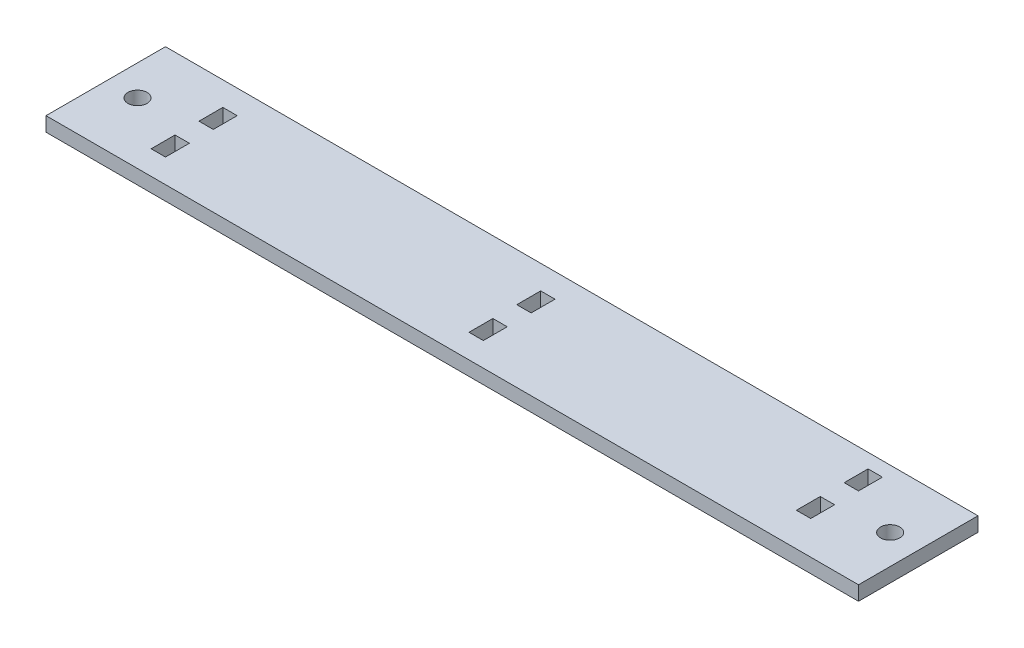
ISO-10303-21;
HEADER;
FILE_DESCRIPTION(('STEP AP214'),'2;1');
FILE_NAME('part.step','',(''),(''),'','','');
FILE_SCHEMA(('AUTOMOTIVE_DESIGN { 1 0 10303 214 1 1 1 1 }'));
ENDSEC;
DATA;
#1=APPLICATION_CONTEXT('core data for automotive mechanical design processes');
#2=APPLICATION_PROTOCOL_DEFINITION('international standard','automotive_design',2000,#1);
#3=PRODUCT_CONTEXT('',#1,'mechanical');
#4=PRODUCT('Part','Part','',(#3));
#5=PRODUCT_RELATED_PRODUCT_CATEGORY('part','',(#4));
#6=PRODUCT_DEFINITION_FORMATION('','',#4);
#7=PRODUCT_DEFINITION_CONTEXT('part definition',#1,'design');
#8=PRODUCT_DEFINITION('design','',#6,#7);
#9=PRODUCT_DEFINITION_SHAPE('','',#8);
#10=(LENGTH_UNIT() NAMED_UNIT(*) SI_UNIT(.MILLI.,.METRE.));
#11=(NAMED_UNIT(*) PLANE_ANGLE_UNIT() SI_UNIT($,.RADIAN.));
#12=(NAMED_UNIT(*) SI_UNIT($,.STERADIAN.) SOLID_ANGLE_UNIT());
#13=UNCERTAINTY_MEASURE_WITH_UNIT(LENGTH_MEASURE(1.E-05),#10,'distance_accuracy_value','');
#14=(GEOMETRIC_REPRESENTATION_CONTEXT(3) GLOBAL_UNCERTAINTY_ASSIGNED_CONTEXT((#13)) GLOBAL_UNIT_ASSIGNED_CONTEXT((#10,
#11,#12)) REPRESENTATION_CONTEXT('',''));
#15=CARTESIAN_POINT('',(0.,0.,0.));
#16=DIRECTION('',(0.,0.,1.));
#17=DIRECTION('',(1.,0.,0.));
#18=AXIS2_PLACEMENT_3D('',#15,#16,#17);
#19=CARTESIAN_POINT('',(-85.,3.,12.5));
#20=DIRECTION('',(0.,1.,0.));
#21=DIRECTION('',(0.,0.,1.));
#22=AXIS2_PLACEMENT_3D('',#19,#20,#21);
#23=PLANE('',#22);
#24=CARTESIAN_POINT('',(-78.65,3.,-0.29));
#25=DIRECTION('',(0.,1.,0.));
#26=DIRECTION('',(0.,0.,1.));
#27=AXIS2_PLACEMENT_3D('',#24,#25,#26);
#28=CIRCLE('',#27,2.);
#29=CARTESIAN_POINT('',(-78.65,3.,1.71));
#30=VERTEX_POINT('',#29);
#31=EDGE_CURVE('E246',#30,#30,#28,.T.);
#32=ORIENTED_EDGE('',*,*,#31,.F.);
#33=EDGE_LOOP('',(#32));
#34=FACE_BOUND('',#33,.T.);
#35=DIRECTION('',(1.,0.,0.));
#36=VECTOR('',#35,1.);
#37=CARTESIAN_POINT('',(65.,3.,-4.5));
#38=LINE('',#37,#36);
#39=CARTESIAN_POINT('',(65.,3.,-4.5));
#40=VERTEX_POINT('',#39);
#41=CARTESIAN_POINT('',(68.,3.,-4.5));
#42=VERTEX_POINT('',#41);
#43=EDGE_CURVE('E258',#40,#42,#38,.T.);
#44=ORIENTED_EDGE('',*,*,#43,.F.);
#45=DIRECTION('',(0.,0.,1.));
#46=VECTOR('',#45,1.);
#47=CARTESIAN_POINT('',(65.,3.,-9.5));
#48=LINE('',#47,#46);
#49=CARTESIAN_POINT('',(65.,3.,-9.5));
#50=VERTEX_POINT('',#49);
#51=EDGE_CURVE('E256',#50,#40,#48,.T.);
#52=ORIENTED_EDGE('',*,*,#51,.F.);
#53=DIRECTION('',(-1.,0.,0.));
#54=VECTOR('',#53,1.);
#55=CARTESIAN_POINT('',(65.,3.,-9.5));
#56=LINE('',#55,#54);
#57=CARTESIAN_POINT('',(68.,3.,-9.5));
#58=VERTEX_POINT('',#57);
#59=EDGE_CURVE('E264',#58,#50,#56,.T.);
#60=ORIENTED_EDGE('',*,*,#59,.F.);
#61=DIRECTION('',(0.,0.,-1.));
#62=VECTOR('',#61,1.);
#63=CARTESIAN_POINT('',(68.,3.,-9.5));
#64=LINE('',#63,#62);
#65=EDGE_CURVE('E261',#42,#58,#64,.T.);
#66=ORIENTED_EDGE('',*,*,#65,.F.);
#67=EDGE_LOOP('',(#44,#52,#60,#66));
#68=FACE_BOUND('',#67,.T.);
#69=DIRECTION('',(1.,0.,0.));
#70=VECTOR('',#69,1.);
#71=CARTESIAN_POINT('',(-68.,3.,-2.5));
#72=LINE('',#71,#70);
#73=CARTESIAN_POINT('',(-68.,3.,-2.5));
#74=VERTEX_POINT('',#73);
#75=CARTESIAN_POINT('',(-65.,3.,-2.5));
#76=VERTEX_POINT('',#75);
#77=EDGE_CURVE('E320',#74,#76,#72,.T.);
#78=ORIENTED_EDGE('',*,*,#77,.F.);
#79=DIRECTION('',(0.,0.,1.));
#80=VECTOR('',#79,1.);
#81=CARTESIAN_POINT('',(-68.,3.,-7.5));
#82=LINE('',#81,#80);
#83=CARTESIAN_POINT('',(-68.,3.,-7.5));
#84=VERTEX_POINT('',#83);
#85=EDGE_CURVE('E318',#84,#74,#82,.T.);
#86=ORIENTED_EDGE('',*,*,#85,.F.);
#87=DIRECTION('',(-1.,0.,0.));
#88=VECTOR('',#87,1.);
#89=CARTESIAN_POINT('',(-68.,3.,-7.5));
#90=LINE('',#89,#88);
#91=CARTESIAN_POINT('',(-65.,3.,-7.5));
#92=VERTEX_POINT('',#91);
#93=EDGE_CURVE('E326',#92,#84,#90,.T.);
#94=ORIENTED_EDGE('',*,*,#93,.F.);
#95=DIRECTION('',(0.,0.,-1.));
#96=VECTOR('',#95,1.);
#97=CARTESIAN_POINT('',(-65.,3.,-7.5));
#98=LINE('',#97,#96);
#99=EDGE_CURVE('E323',#76,#92,#98,.T.);
#100=ORIENTED_EDGE('',*,*,#99,.F.);
#101=EDGE_LOOP('',(#78,#86,#94,#100));
#102=FACE_BOUND('',#101,.T.);
#103=DIRECTION('',(1.,0.,0.));
#104=VECTOR('',#103,1.);
#105=CARTESIAN_POINT('',(-1.5,3.,-2.5));
#106=LINE('',#105,#104);
#107=CARTESIAN_POINT('',(-1.5,3.,-2.5));
#108=VERTEX_POINT('',#107);
#109=CARTESIAN_POINT('',(1.5,3.,-2.5));
#110=VERTEX_POINT('',#109);
#111=EDGE_CURVE('E382',#108,#110,#106,.T.);
#112=ORIENTED_EDGE('',*,*,#111,.F.);
#113=DIRECTION('',(0.,0.,1.));
#114=VECTOR('',#113,1.);
#115=CARTESIAN_POINT('',(-1.5,3.,-7.5));
#116=LINE('',#115,#114);
#117=CARTESIAN_POINT('',(-1.5,3.,-7.5));
#118=VERTEX_POINT('',#117);
#119=EDGE_CURVE('E380',#118,#108,#116,.T.);
#120=ORIENTED_EDGE('',*,*,#119,.F.);
#121=DIRECTION('',(-1.,0.,0.));
#122=VECTOR('',#121,1.);
#123=CARTESIAN_POINT('',(-1.5,3.,-7.5));
#124=LINE('',#123,#122);
#125=CARTESIAN_POINT('',(1.5,3.,-7.5));
#126=VERTEX_POINT('',#125);
#127=EDGE_CURVE('E388',#126,#118,#124,.T.);
#128=ORIENTED_EDGE('',*,*,#127,.F.);
#129=DIRECTION('',(0.,0.,-1.));
#130=VECTOR('',#129,1.);
#131=CARTESIAN_POINT('',(1.5,3.,-7.5));
#132=LINE('',#131,#130);
#133=EDGE_CURVE('E385',#110,#126,#132,.T.);
#134=ORIENTED_EDGE('',*,*,#133,.F.);
#135=EDGE_LOOP('',(#112,#120,#128,#134));
#136=FACE_BOUND('',#135,.T.);
#137=DIRECTION('',(0.,0.,1.));
#138=VECTOR('',#137,1.);
#139=CARTESIAN_POINT('',(-85.,3.,-12.5));
#140=LINE('',#139,#138);
#141=CARTESIAN_POINT('',(-85.,3.,-12.5));
#142=VERTEX_POINT('',#141);
#143=CARTESIAN_POINT('',(-85.,3.,12.5));
#144=VERTEX_POINT('',#143);
#145=EDGE_CURVE('E411',#142,#144,#140,.T.);
#146=ORIENTED_EDGE('',*,*,#145,.T.);
#147=DIRECTION('',(1.,0.,0.));
#148=VECTOR('',#147,1.);
#149=CARTESIAN_POINT('',(-85.,3.,12.5));
#150=LINE('',#149,#148);
#151=CARTESIAN_POINT('',(85.,3.,12.5));
#152=VERTEX_POINT('',#151);
#153=EDGE_CURVE('E414',#144,#152,#150,.T.);
#154=ORIENTED_EDGE('',*,*,#153,.T.);
#155=DIRECTION('',(0.,0.,-1.));
#156=VECTOR('',#155,1.);
#157=CARTESIAN_POINT('',(85.,3.,-12.5));
#158=LINE('',#157,#156);
#159=CARTESIAN_POINT('',(85.,3.,-12.5));
#160=VERTEX_POINT('',#159);
#161=EDGE_CURVE('E417',#152,#160,#158,.T.);
#162=ORIENTED_EDGE('',*,*,#161,.T.);
#163=DIRECTION('',(-1.,0.,0.));
#164=VECTOR('',#163,1.);
#165=CARTESIAN_POINT('',(-85.,3.,-12.5));
#166=LINE('',#165,#164);
#167=EDGE_CURVE('E419',#160,#142,#166,.T.);
#168=ORIENTED_EDGE('',*,*,#167,.T.);
#169=EDGE_LOOP('',(#146,#154,#162,#168));
#170=FACE_BOUND('',#169,.T.);
#171=DIRECTION('',(1.,0.,0.));
#172=VECTOR('',#171,1.);
#173=CARTESIAN_POINT('',(-1.5,3.,7.5));
#174=LINE('',#173,#172);
#175=CARTESIAN_POINT('',(-1.5,3.,7.5));
#176=VERTEX_POINT('',#175);
#177=CARTESIAN_POINT('',(1.5,3.,7.5));
#178=VERTEX_POINT('',#177);
#179=EDGE_CURVE('E351',#176,#178,#174,.T.);
#180=ORIENTED_EDGE('',*,*,#179,.F.);
#181=DIRECTION('',(0.,0.,1.));
#182=VECTOR('',#181,1.);
#183=CARTESIAN_POINT('',(-1.5,3.,2.5));
#184=LINE('',#183,#182);
#185=CARTESIAN_POINT('',(-1.5,3.,2.5));
#186=VERTEX_POINT('',#185);
#187=EDGE_CURVE('E349',#186,#176,#184,.T.);
#188=ORIENTED_EDGE('',*,*,#187,.F.);
#189=DIRECTION('',(-1.,0.,0.));
#190=VECTOR('',#189,1.);
#191=CARTESIAN_POINT('',(-1.5,3.,2.5));
#192=LINE('',#191,#190);
#193=CARTESIAN_POINT('',(1.5,3.,2.5));
#194=VERTEX_POINT('',#193);
#195=EDGE_CURVE('E357',#194,#186,#192,.T.);
#196=ORIENTED_EDGE('',*,*,#195,.F.);
#197=DIRECTION('',(0.,0.,-1.));
#198=VECTOR('',#197,1.);
#199=CARTESIAN_POINT('',(1.5,3.,2.5));
#200=LINE('',#199,#198);
#201=EDGE_CURVE('E354',#178,#194,#200,.T.);
#202=ORIENTED_EDGE('',*,*,#201,.F.);
#203=EDGE_LOOP('',(#180,#188,#196,#202));
#204=FACE_BOUND('',#203,.T.);
#205=DIRECTION('',(1.,0.,0.));
#206=VECTOR('',#205,1.);
#207=CARTESIAN_POINT('',(-68.,3.,7.5));
#208=LINE('',#207,#206);
#209=CARTESIAN_POINT('',(-68.,3.,7.5));
#210=VERTEX_POINT('',#209);
#211=CARTESIAN_POINT('',(-65.,3.,7.5));
#212=VERTEX_POINT('',#211);
#213=EDGE_CURVE('E289',#210,#212,#208,.T.);
#214=ORIENTED_EDGE('',*,*,#213,.F.);
#215=DIRECTION('',(0.,0.,1.));
#216=VECTOR('',#215,1.);
#217=CARTESIAN_POINT('',(-68.,3.,2.5));
#218=LINE('',#217,#216);
#219=CARTESIAN_POINT('',(-68.,3.,2.5));
#220=VERTEX_POINT('',#219);
#221=EDGE_CURVE('E287',#220,#210,#218,.T.);
#222=ORIENTED_EDGE('',*,*,#221,.F.);
#223=DIRECTION('',(-1.,0.,0.));
#224=VECTOR('',#223,1.);
#225=CARTESIAN_POINT('',(-68.,3.,2.5));
#226=LINE('',#225,#224);
#227=CARTESIAN_POINT('',(-65.,3.,2.5));
#228=VERTEX_POINT('',#227);
#229=EDGE_CURVE('E295',#228,#220,#226,.T.);
#230=ORIENTED_EDGE('',*,*,#229,.F.);
#231=DIRECTION('',(0.,0.,-1.));
#232=VECTOR('',#231,1.);
#233=CARTESIAN_POINT('',(-65.,3.,2.5));
#234=LINE('',#233,#232);
#235=EDGE_CURVE('E292',#212,#228,#234,.T.);
#236=ORIENTED_EDGE('',*,*,#235,.F.);
#237=EDGE_LOOP('',(#214,#222,#230,#236));
#238=FACE_BOUND('',#237,.T.);
#239=DIRECTION('',(1.,0.,0.));
#240=VECTOR('',#239,1.);
#241=CARTESIAN_POINT('',(65.,3.,5.5));
#242=LINE('',#241,#240);
#243=CARTESIAN_POINT('',(65.,3.,5.5));
#244=VERTEX_POINT('',#243);
#245=CARTESIAN_POINT('',(68.,3.,5.5));
#246=VERTEX_POINT('',#245);
#247=EDGE_CURVE('E225',#244,#246,#242,.T.);
#248=ORIENTED_EDGE('',*,*,#247,.F.);
#249=DIRECTION('',(0.,0.,1.));
#250=VECTOR('',#249,1.);
#251=CARTESIAN_POINT('',(65.,3.,0.500000000000002));
#252=LINE('',#251,#250);
#253=CARTESIAN_POINT('',(65.,3.,0.500000000000002));
#254=VERTEX_POINT('',#253);
#255=EDGE_CURVE('E217',#254,#244,#252,.T.);
#256=ORIENTED_EDGE('',*,*,#255,.F.);
#257=DIRECTION('',(-1.,0.,0.));
#258=VECTOR('',#257,1.);
#259=CARTESIAN_POINT('',(65.,3.,0.500000000000002));
#260=LINE('',#259,#258);
#261=CARTESIAN_POINT('',(68.,3.,0.500000000000002));
#262=VERTEX_POINT('',#261);
#263=EDGE_CURVE('E240',#262,#254,#260,.T.);
#264=ORIENTED_EDGE('',*,*,#263,.F.);
#265=DIRECTION('',(0.,0.,-1.));
#266=VECTOR('',#265,1.);
#267=CARTESIAN_POINT('',(68.,3.,0.500000000000002));
#268=LINE('',#267,#266);
#269=EDGE_CURVE('E238',#246,#262,#268,.T.);
#270=ORIENTED_EDGE('',*,*,#269,.F.);
#271=EDGE_LOOP('',(#248,#256,#264,#270));
#272=FACE_BOUND('',#271,.T.);
#273=CARTESIAN_POINT('',(78.83,3.,-0.29));
#274=DIRECTION('',(0.,1.,0.));
#275=DIRECTION('',(0.,0.,1.));
#276=AXIS2_PLACEMENT_3D('',#273,#274,#275);
#277=CIRCLE('',#276,2.);
#278=CARTESIAN_POINT('',(78.83,3.,1.71));
#279=VERTEX_POINT('',#278);
#280=EDGE_CURVE('E595',#279,#279,#277,.T.);
#281=ORIENTED_EDGE('',*,*,#280,.F.);
#282=EDGE_LOOP('',(#281));
#283=FACE_BOUND('',#282,.T.);
#284=ADVANCED_FACE('F32',(#34,#68,#102,#136,#170,#204,#238,#272,#283),#23,.T.);
#285=CARTESIAN_POINT('',(-85.,0.,12.5));
#286=DIRECTION('',(0.,1.,0.));
#287=DIRECTION('',(0.,0.,1.));
#288=AXIS2_PLACEMENT_3D('',#285,#286,#287);
#289=PLANE('',#288);
#290=CARTESIAN_POINT('',(-78.65,0.,-0.29));
#291=DIRECTION('',(0.,1.,0.));
#292=DIRECTION('',(0.,0.,1.));
#293=AXIS2_PLACEMENT_3D('',#290,#291,#292);
#294=CIRCLE('',#293,2.);
#295=CARTESIAN_POINT('',(-78.65,0.,1.71));
#296=VERTEX_POINT('',#295);
#297=EDGE_CURVE('E601',#296,#296,#294,.T.);
#298=ORIENTED_EDGE('',*,*,#297,.T.);
#299=EDGE_LOOP('',(#298));
#300=FACE_BOUND('',#299,.T.);
#301=DIRECTION('',(0.,0.,1.));
#302=VECTOR('',#301,1.);
#303=CARTESIAN_POINT('',(65.,0.,-9.5));
#304=LINE('',#303,#302);
#305=CARTESIAN_POINT('',(65.,0.,-9.5));
#306=VERTEX_POINT('',#305);
#307=CARTESIAN_POINT('',(65.,0.,-4.5));
#308=VERTEX_POINT('',#307);
#309=EDGE_CURVE('E233',#306,#308,#304,.T.);
#310=ORIENTED_EDGE('',*,*,#309,.T.);
#311=DIRECTION('',(1.,0.,0.));
#312=VECTOR('',#311,1.);
#313=CARTESIAN_POINT('',(65.,0.,-4.5));
#314=LINE('',#313,#312);
#315=CARTESIAN_POINT('',(68.,0.,-4.5));
#316=VERTEX_POINT('',#315);
#317=EDGE_CURVE('E269',#308,#316,#314,.T.);
#318=ORIENTED_EDGE('',*,*,#317,.T.);
#319=DIRECTION('',(0.,0.,-1.));
#320=VECTOR('',#319,1.);
#321=CARTESIAN_POINT('',(68.,0.,-9.5));
#322=LINE('',#321,#320);
#323=CARTESIAN_POINT('',(68.,0.,-9.5));
#324=VERTEX_POINT('',#323);
#325=EDGE_CURVE('E272',#316,#324,#322,.T.);
#326=ORIENTED_EDGE('',*,*,#325,.T.);
#327=DIRECTION('',(-1.,0.,0.));
#328=VECTOR('',#327,1.);
#329=CARTESIAN_POINT('',(65.,0.,-9.5));
#330=LINE('',#329,#328);
#331=EDGE_CURVE('E259',#324,#306,#330,.T.);
#332=ORIENTED_EDGE('',*,*,#331,.T.);
#333=EDGE_LOOP('',(#310,#318,#326,#332));
#334=FACE_BOUND('',#333,.T.);
#335=DIRECTION('',(0.,0.,1.));
#336=VECTOR('',#335,1.);
#337=CARTESIAN_POINT('',(-68.,0.,-7.5));
#338=LINE('',#337,#336);
#339=CARTESIAN_POINT('',(-68.,0.,-7.5));
#340=VERTEX_POINT('',#339);
#341=CARTESIAN_POINT('',(-68.,0.,-2.5));
#342=VERTEX_POINT('',#341);
#343=EDGE_CURVE('E317',#340,#342,#338,.T.);
#344=ORIENTED_EDGE('',*,*,#343,.T.);
#345=DIRECTION('',(1.,0.,0.));
#346=VECTOR('',#345,1.);
#347=CARTESIAN_POINT('',(-68.,0.,-2.5));
#348=LINE('',#347,#346);
#349=CARTESIAN_POINT('',(-65.,0.,-2.5));
#350=VERTEX_POINT('',#349);
#351=EDGE_CURVE('E331',#342,#350,#348,.T.);
#352=ORIENTED_EDGE('',*,*,#351,.T.);
#353=DIRECTION('',(0.,0.,-1.));
#354=VECTOR('',#353,1.);
#355=CARTESIAN_POINT('',(-65.,0.,-7.5));
#356=LINE('',#355,#354);
#357=CARTESIAN_POINT('',(-65.,0.,-7.5));
#358=VERTEX_POINT('',#357);
#359=EDGE_CURVE('E334',#350,#358,#356,.T.);
#360=ORIENTED_EDGE('',*,*,#359,.T.);
#361=DIRECTION('',(-1.,0.,0.));
#362=VECTOR('',#361,1.);
#363=CARTESIAN_POINT('',(-68.,0.,-7.5));
#364=LINE('',#363,#362);
#365=EDGE_CURVE('E321',#358,#340,#364,.T.);
#366=ORIENTED_EDGE('',*,*,#365,.T.);
#367=EDGE_LOOP('',(#344,#352,#360,#366));
#368=FACE_BOUND('',#367,.T.);
#369=DIRECTION('',(0.,0.,1.));
#370=VECTOR('',#369,1.);
#371=CARTESIAN_POINT('',(-1.5,0.,-7.5));
#372=LINE('',#371,#370);
#373=CARTESIAN_POINT('',(-1.5,0.,-7.5));
#374=VERTEX_POINT('',#373);
#375=CARTESIAN_POINT('',(-1.5,0.,-2.5));
#376=VERTEX_POINT('',#375);
#377=EDGE_CURVE('E379',#374,#376,#372,.T.);
#378=ORIENTED_EDGE('',*,*,#377,.T.);
#379=DIRECTION('',(1.,0.,0.));
#380=VECTOR('',#379,1.);
#381=CARTESIAN_POINT('',(-1.5,0.,-2.5));
#382=LINE('',#381,#380);
#383=CARTESIAN_POINT('',(1.5,0.,-2.5));
#384=VERTEX_POINT('',#383);
#385=EDGE_CURVE('E393',#376,#384,#382,.T.);
#386=ORIENTED_EDGE('',*,*,#385,.T.);
#387=DIRECTION('',(0.,0.,-1.));
#388=VECTOR('',#387,1.);
#389=CARTESIAN_POINT('',(1.5,0.,-7.5));
#390=LINE('',#389,#388);
#391=CARTESIAN_POINT('',(1.5,0.,-7.5));
#392=VERTEX_POINT('',#391);
#393=EDGE_CURVE('E396',#384,#392,#390,.T.);
#394=ORIENTED_EDGE('',*,*,#393,.T.);
#395=DIRECTION('',(-1.,0.,0.));
#396=VECTOR('',#395,1.);
#397=CARTESIAN_POINT('',(-1.5,0.,-7.5));
#398=LINE('',#397,#396);
#399=EDGE_CURVE('E383',#392,#374,#398,.T.);
#400=ORIENTED_EDGE('',*,*,#399,.T.);
#401=EDGE_LOOP('',(#378,#386,#394,#400));
#402=FACE_BOUND('',#401,.T.);
#403=DIRECTION('',(0.,0.,1.));
#404=VECTOR('',#403,1.);
#405=CARTESIAN_POINT('',(-85.,0.,-12.5));
#406=LINE('',#405,#404);
#407=CARTESIAN_POINT('',(-85.,0.,-12.5));
#408=VERTEX_POINT('',#407);
#409=CARTESIAN_POINT('',(-85.,0.,12.5));
#410=VERTEX_POINT('',#409);
#411=EDGE_CURVE('E410',#408,#410,#406,.T.);
#412=ORIENTED_EDGE('',*,*,#411,.F.);
#413=DIRECTION('',(-1.,0.,0.));
#414=VECTOR('',#413,1.);
#415=CARTESIAN_POINT('',(-85.,0.,-12.5));
#416=LINE('',#415,#414);
#417=CARTESIAN_POINT('',(85.,0.,-12.5));
#418=VERTEX_POINT('',#417);
#419=EDGE_CURVE('E415',#418,#408,#416,.T.);
#420=ORIENTED_EDGE('',*,*,#419,.F.);
#421=DIRECTION('',(0.,0.,-1.));
#422=VECTOR('',#421,1.);
#423=CARTESIAN_POINT('',(85.,0.,-12.5));
#424=LINE('',#423,#422);
#425=CARTESIAN_POINT('',(85.,0.,12.5));
#426=VERTEX_POINT('',#425);
#427=EDGE_CURVE('E426',#426,#418,#424,.T.);
#428=ORIENTED_EDGE('',*,*,#427,.F.);
#429=DIRECTION('',(1.,0.,0.));
#430=VECTOR('',#429,1.);
#431=CARTESIAN_POINT('',(-85.,0.,12.5));
#432=LINE('',#431,#430);
#433=EDGE_CURVE('E424',#410,#426,#432,.T.);
#434=ORIENTED_EDGE('',*,*,#433,.F.);
#435=EDGE_LOOP('',(#412,#420,#428,#434));
#436=FACE_BOUND('',#435,.T.);
#437=DIRECTION('',(0.,0.,1.));
#438=VECTOR('',#437,1.);
#439=CARTESIAN_POINT('',(-1.5,0.,2.5));
#440=LINE('',#439,#438);
#441=CARTESIAN_POINT('',(-1.5,0.,2.5));
#442=VERTEX_POINT('',#441);
#443=CARTESIAN_POINT('',(-1.5,0.,7.5));
#444=VERTEX_POINT('',#443);
#445=EDGE_CURVE('E348',#442,#444,#440,.T.);
#446=ORIENTED_EDGE('',*,*,#445,.T.);
#447=DIRECTION('',(1.,0.,0.));
#448=VECTOR('',#447,1.);
#449=CARTESIAN_POINT('',(-1.5,0.,7.5));
#450=LINE('',#449,#448);
#451=CARTESIAN_POINT('',(1.5,0.,7.5));
#452=VERTEX_POINT('',#451);
#453=EDGE_CURVE('E362',#444,#452,#450,.T.);
#454=ORIENTED_EDGE('',*,*,#453,.T.);
#455=DIRECTION('',(0.,0.,-1.));
#456=VECTOR('',#455,1.);
#457=CARTESIAN_POINT('',(1.5,0.,2.5));
#458=LINE('',#457,#456);
#459=CARTESIAN_POINT('',(1.5,0.,2.5));
#460=VERTEX_POINT('',#459);
#461=EDGE_CURVE('E365',#452,#460,#458,.T.);
#462=ORIENTED_EDGE('',*,*,#461,.T.);
#463=DIRECTION('',(-1.,0.,0.));
#464=VECTOR('',#463,1.);
#465=CARTESIAN_POINT('',(-1.5,0.,2.5));
#466=LINE('',#465,#464);
#467=EDGE_CURVE('E352',#460,#442,#466,.T.);
#468=ORIENTED_EDGE('',*,*,#467,.T.);
#469=EDGE_LOOP('',(#446,#454,#462,#468));
#470=FACE_BOUND('',#469,.T.);
#471=DIRECTION('',(0.,0.,1.));
#472=VECTOR('',#471,1.);
#473=CARTESIAN_POINT('',(-68.,0.,2.5));
#474=LINE('',#473,#472);
#475=CARTESIAN_POINT('',(-68.,0.,2.5));
#476=VERTEX_POINT('',#475);
#477=CARTESIAN_POINT('',(-68.,0.,7.5));
#478=VERTEX_POINT('',#477);
#479=EDGE_CURVE('E286',#476,#478,#474,.T.);
#480=ORIENTED_EDGE('',*,*,#479,.T.);
#481=DIRECTION('',(1.,0.,0.));
#482=VECTOR('',#481,1.);
#483=CARTESIAN_POINT('',(-68.,0.,7.5));
#484=LINE('',#483,#482);
#485=CARTESIAN_POINT('',(-65.,0.,7.5));
#486=VERTEX_POINT('',#485);
#487=EDGE_CURVE('E300',#478,#486,#484,.T.);
#488=ORIENTED_EDGE('',*,*,#487,.T.);
#489=DIRECTION('',(0.,0.,-1.));
#490=VECTOR('',#489,1.);
#491=CARTESIAN_POINT('',(-65.,0.,2.5));
#492=LINE('',#491,#490);
#493=CARTESIAN_POINT('',(-65.,0.,2.5));
#494=VERTEX_POINT('',#493);
#495=EDGE_CURVE('E303',#486,#494,#492,.T.);
#496=ORIENTED_EDGE('',*,*,#495,.T.);
#497=DIRECTION('',(-1.,0.,0.));
#498=VECTOR('',#497,1.);
#499=CARTESIAN_POINT('',(-68.,0.,2.5));
#500=LINE('',#499,#498);
#501=EDGE_CURVE('E290',#494,#476,#500,.T.);
#502=ORIENTED_EDGE('',*,*,#501,.T.);
#503=EDGE_LOOP('',(#480,#488,#496,#502));
#504=FACE_BOUND('',#503,.T.);
#505=DIRECTION('',(0.,0.,1.));
#506=VECTOR('',#505,1.);
#507=CARTESIAN_POINT('',(65.,0.,0.500000000000002));
#508=LINE('',#507,#506);
#509=CARTESIAN_POINT('',(65.,0.,0.500000000000002));
#510=VERTEX_POINT('',#509);
#511=CARTESIAN_POINT('',(65.,0.,5.5));
#512=VERTEX_POINT('',#511);
#513=EDGE_CURVE('E55',#510,#512,#508,.T.);
#514=ORIENTED_EDGE('',*,*,#513,.T.);
#515=DIRECTION('',(1.,0.,0.));
#516=VECTOR('',#515,1.);
#517=CARTESIAN_POINT('',(65.,0.,5.5));
#518=LINE('',#517,#516);
#519=CARTESIAN_POINT('',(68.,0.,5.5));
#520=VERTEX_POINT('',#519);
#521=EDGE_CURVE('E232',#512,#520,#518,.T.);
#522=ORIENTED_EDGE('',*,*,#521,.T.);
#523=DIRECTION('',(0.,0.,-1.));
#524=VECTOR('',#523,1.);
#525=CARTESIAN_POINT('',(68.,0.,0.500000000000002));
#526=LINE('',#525,#524);
#527=CARTESIAN_POINT('',(68.,0.,0.500000000000002));
#528=VERTEX_POINT('',#527);
#529=EDGE_CURVE('E248',#520,#528,#526,.T.);
#530=ORIENTED_EDGE('',*,*,#529,.T.);
#531=DIRECTION('',(-1.,0.,0.));
#532=VECTOR('',#531,1.);
#533=CARTESIAN_POINT('',(65.,0.,0.500000000000002));
#534=LINE('',#533,#532);
#535=EDGE_CURVE('E226',#528,#510,#534,.T.);
#536=ORIENTED_EDGE('',*,*,#535,.T.);
#537=EDGE_LOOP('',(#514,#522,#530,#536));
#538=FACE_BOUND('',#537,.T.);
#539=CARTESIAN_POINT('',(78.83,0.,-0.29));
#540=DIRECTION('',(0.,1.,0.));
#541=DIRECTION('',(0.,0.,1.));
#542=AXIS2_PLACEMENT_3D('',#539,#540,#541);
#543=CIRCLE('',#542,2.);
#544=CARTESIAN_POINT('',(78.83,0.,1.71));
#545=VERTEX_POINT('',#544);
#546=EDGE_CURVE('E598',#545,#545,#543,.T.);
#547=ORIENTED_EDGE('',*,*,#546,.T.);
#548=EDGE_LOOP('',(#547));
#549=FACE_BOUND('',#548,.T.);
#550=ADVANCED_FACE('F444',(#300,#334,#368,#402,#436,#470,#504,#538,#549),#289,.F.);
#551=CARTESIAN_POINT('',(-85.,3.,-12.5));
#552=DIRECTION('',(1.,0.,0.));
#553=DIRECTION('',(0.,0.,-1.));
#554=AXIS2_PLACEMENT_3D('',#551,#552,#553);
#555=PLANE('',#554);
#556=ORIENTED_EDGE('',*,*,#411,.T.);
#557=DIRECTION('',(0.,-1.,0.));
#558=VECTOR('',#557,1.);
#559=CARTESIAN_POINT('',(-85.,3.,12.5));
#560=LINE('',#559,#558);
#561=EDGE_CURVE('E11',#144,#410,#560,.T.);
#562=ORIENTED_EDGE('',*,*,#561,.F.);
#563=ORIENTED_EDGE('',*,*,#145,.F.);
#564=DIRECTION('',(0.,-1.,0.));
#565=VECTOR('',#564,1.);
#566=CARTESIAN_POINT('',(-85.,3.,-12.5));
#567=LINE('',#566,#565);
#568=EDGE_CURVE('E421',#142,#408,#567,.T.);
#569=ORIENTED_EDGE('',*,*,#568,.T.);
#570=EDGE_LOOP('',(#556,#562,#563,#569));
#571=FACE_BOUND('',#570,.T.);
#572=ADVANCED_FACE('F34',(#571),#555,.F.);
#573=CARTESIAN_POINT('',(-85.,3.,12.5));
#574=DIRECTION('',(0.,0.,-1.));
#575=DIRECTION('',(-1.,0.,0.));
#576=AXIS2_PLACEMENT_3D('',#573,#574,#575);
#577=PLANE('',#576);
#578=ORIENTED_EDGE('',*,*,#433,.T.);
#579=DIRECTION('',(0.,-1.,0.));
#580=VECTOR('',#579,1.);
#581=CARTESIAN_POINT('',(85.,3.,12.5));
#582=LINE('',#581,#580);
#583=EDGE_CURVE('E40',#152,#426,#582,.T.);
#584=ORIENTED_EDGE('',*,*,#583,.F.);
#585=ORIENTED_EDGE('',*,*,#153,.F.);
#586=ORIENTED_EDGE('',*,*,#561,.T.);
#587=EDGE_LOOP('',(#578,#584,#585,#586));
#588=FACE_BOUND('',#587,.T.);
#589=ADVANCED_FACE('F455',(#588),#577,.F.);
#590=CARTESIAN_POINT('',(85.,3.,-12.5));
#591=DIRECTION('',(-1.,0.,0.));
#592=DIRECTION('',(0.,0.,1.));
#593=AXIS2_PLACEMENT_3D('',#590,#591,#592);
#594=PLANE('',#593);
#595=ORIENTED_EDGE('',*,*,#427,.T.);
#596=DIRECTION('',(0.,-1.,0.));
#597=VECTOR('',#596,1.);
#598=CARTESIAN_POINT('',(85.,3.,-12.5));
#599=LINE('',#598,#597);
#600=EDGE_CURVE('E431',#160,#418,#599,.T.);
#601=ORIENTED_EDGE('',*,*,#600,.F.);
#602=ORIENTED_EDGE('',*,*,#161,.F.);
#603=ORIENTED_EDGE('',*,*,#583,.T.);
#604=EDGE_LOOP('',(#595,#601,#602,#603));
#605=FACE_BOUND('',#604,.T.);
#606=ADVANCED_FACE('F438',(#605),#594,.F.);
#607=CARTESIAN_POINT('',(-85.,3.,-12.5));
#608=DIRECTION('',(0.,0.,1.));
#609=DIRECTION('',(1.,0.,0.));
#610=AXIS2_PLACEMENT_3D('',#607,#608,#609);
#611=PLANE('',#610);
#612=ORIENTED_EDGE('',*,*,#419,.T.);
#613=ORIENTED_EDGE('',*,*,#568,.F.);
#614=ORIENTED_EDGE('',*,*,#167,.F.);
#615=ORIENTED_EDGE('',*,*,#600,.T.);
#616=EDGE_LOOP('',(#612,#613,#614,#615));
#617=FACE_BOUND('',#616,.T.);
#618=ADVANCED_FACE('F448',(#617),#611,.F.);
#619=CARTESIAN_POINT('',(-1.5,3.,-7.5));
#620=DIRECTION('',(1.,0.,0.));
#621=DIRECTION('',(0.,0.,-1.));
#622=AXIS2_PLACEMENT_3D('',#619,#620,#621);
#623=PLANE('',#622);
#624=ORIENTED_EDGE('',*,*,#377,.F.);
#625=DIRECTION('',(0.,-1.,0.));
#626=VECTOR('',#625,1.);
#627=CARTESIAN_POINT('',(-1.5,3.,-7.5));
#628=LINE('',#627,#626);
#629=EDGE_CURVE('E390',#118,#374,#628,.T.);
#630=ORIENTED_EDGE('',*,*,#629,.F.);
#631=ORIENTED_EDGE('',*,*,#119,.T.);
#632=DIRECTION('',(0.,-1.,0.));
#633=VECTOR('',#632,1.);
#634=CARTESIAN_POINT('',(-1.5,3.,-2.5));
#635=LINE('',#634,#633);
#636=EDGE_CURVE('E407',#108,#376,#635,.T.);
#637=ORIENTED_EDGE('',*,*,#636,.T.);
#638=EDGE_LOOP('',(#624,#630,#631,#637));
#639=FACE_BOUND('',#638,.T.);
#640=ADVANCED_FACE('F473',(#639),#623,.T.);
#641=CARTESIAN_POINT('',(-1.5,3.,-2.5));
#642=DIRECTION('',(0.,0.,-1.));
#643=DIRECTION('',(-1.,0.,0.));
#644=AXIS2_PLACEMENT_3D('',#641,#642,#643);
#645=PLANE('',#644);
#646=ORIENTED_EDGE('',*,*,#385,.F.);
#647=ORIENTED_EDGE('',*,*,#636,.F.);
#648=ORIENTED_EDGE('',*,*,#111,.T.);
#649=DIRECTION('',(0.,-1.,0.));
#650=VECTOR('',#649,1.);
#651=CARTESIAN_POINT('',(1.5,3.,-2.5));
#652=LINE('',#651,#650);
#653=EDGE_CURVE('E405',#110,#384,#652,.T.);
#654=ORIENTED_EDGE('',*,*,#653,.T.);
#655=EDGE_LOOP('',(#646,#647,#648,#654));
#656=FACE_BOUND('',#655,.T.);
#657=ADVANCED_FACE('F480',(#656),#645,.T.);
#658=CARTESIAN_POINT('',(1.5,3.,-7.5));
#659=DIRECTION('',(-1.,0.,0.));
#660=DIRECTION('',(0.,0.,1.));
#661=AXIS2_PLACEMENT_3D('',#658,#659,#660);
#662=PLANE('',#661);
#663=ORIENTED_EDGE('',*,*,#393,.F.);
#664=ORIENTED_EDGE('',*,*,#653,.F.);
#665=ORIENTED_EDGE('',*,*,#133,.T.);
#666=DIRECTION('',(0.,-1.,0.));
#667=VECTOR('',#666,1.);
#668=CARTESIAN_POINT('',(1.5,3.,-7.5));
#669=LINE('',#668,#667);
#670=EDGE_CURVE('E403',#126,#392,#669,.T.);
#671=ORIENTED_EDGE('',*,*,#670,.T.);
#672=EDGE_LOOP('',(#663,#664,#665,#671));
#673=FACE_BOUND('',#672,.T.);
#674=ADVANCED_FACE('F485',(#673),#662,.T.);
#675=CARTESIAN_POINT('',(-1.5,3.,-7.5));
#676=DIRECTION('',(0.,0.,1.));
#677=DIRECTION('',(1.,0.,0.));
#678=AXIS2_PLACEMENT_3D('',#675,#676,#677);
#679=PLANE('',#678);
#680=ORIENTED_EDGE('',*,*,#399,.F.);
#681=ORIENTED_EDGE('',*,*,#670,.F.);
#682=ORIENTED_EDGE('',*,*,#127,.T.);
#683=ORIENTED_EDGE('',*,*,#629,.T.);
#684=EDGE_LOOP('',(#680,#681,#682,#683));
#685=FACE_BOUND('',#684,.T.);
#686=ADVANCED_FACE('F493',(#685),#679,.T.);
#687=CARTESIAN_POINT('',(-1.5,3.,2.5));
#688=DIRECTION('',(1.,0.,0.));
#689=DIRECTION('',(0.,0.,-1.));
#690=AXIS2_PLACEMENT_3D('',#687,#688,#689);
#691=PLANE('',#690);
#692=ORIENTED_EDGE('',*,*,#445,.F.);
#693=DIRECTION('',(0.,-1.,0.));
#694=VECTOR('',#693,1.);
#695=CARTESIAN_POINT('',(-1.5,3.,2.5));
#696=LINE('',#695,#694);
#697=EDGE_CURVE('E359',#186,#442,#696,.T.);
#698=ORIENTED_EDGE('',*,*,#697,.F.);
#699=ORIENTED_EDGE('',*,*,#187,.T.);
#700=DIRECTION('',(0.,-1.,0.));
#701=VECTOR('',#700,1.);
#702=CARTESIAN_POINT('',(-1.5,3.,7.5));
#703=LINE('',#702,#701);
#704=EDGE_CURVE('E376',#176,#444,#703,.T.);
#705=ORIENTED_EDGE('',*,*,#704,.T.);
#706=EDGE_LOOP('',(#692,#698,#699,#705));
#707=FACE_BOUND('',#706,.T.);
#708=ADVANCED_FACE('F506',(#707),#691,.T.);
#709=CARTESIAN_POINT('',(-1.5,3.,7.5));
#710=DIRECTION('',(0.,0.,-1.));
#711=DIRECTION('',(-1.,0.,0.));
#712=AXIS2_PLACEMENT_3D('',#709,#710,#711);
#713=PLANE('',#712);
#714=ORIENTED_EDGE('',*,*,#453,.F.);
#715=ORIENTED_EDGE('',*,*,#704,.F.);
#716=ORIENTED_EDGE('',*,*,#179,.T.);
#717=DIRECTION('',(0.,-1.,0.));
#718=VECTOR('',#717,1.);
#719=CARTESIAN_POINT('',(1.5,3.,7.5));
#720=LINE('',#719,#718);
#721=EDGE_CURVE('E374',#178,#452,#720,.T.);
#722=ORIENTED_EDGE('',*,*,#721,.T.);
#723=EDGE_LOOP('',(#714,#715,#716,#722));
#724=FACE_BOUND('',#723,.T.);
#725=ADVANCED_FACE('F511',(#724),#713,.T.);
#726=CARTESIAN_POINT('',(1.5,3.,2.5));
#727=DIRECTION('',(-1.,0.,0.));
#728=DIRECTION('',(0.,0.,1.));
#729=AXIS2_PLACEMENT_3D('',#726,#727,#728);
#730=PLANE('',#729);
#731=ORIENTED_EDGE('',*,*,#461,.F.);
#732=ORIENTED_EDGE('',*,*,#721,.F.);
#733=ORIENTED_EDGE('',*,*,#201,.T.);
#734=DIRECTION('',(0.,-1.,0.));
#735=VECTOR('',#734,1.);
#736=CARTESIAN_POINT('',(1.5,3.,2.5));
#737=LINE('',#736,#735);
#738=EDGE_CURVE('E372',#194,#460,#737,.T.);
#739=ORIENTED_EDGE('',*,*,#738,.T.);
#740=EDGE_LOOP('',(#731,#732,#733,#739));
#741=FACE_BOUND('',#740,.T.);
#742=ADVANCED_FACE('F515',(#741),#730,.T.);
#743=CARTESIAN_POINT('',(-1.5,3.,2.5));
#744=DIRECTION('',(0.,0.,1.));
#745=DIRECTION('',(1.,0.,0.));
#746=AXIS2_PLACEMENT_3D('',#743,#744,#745);
#747=PLANE('',#746);
#748=ORIENTED_EDGE('',*,*,#467,.F.);
#749=ORIENTED_EDGE('',*,*,#738,.F.);
#750=ORIENTED_EDGE('',*,*,#195,.T.);
#751=ORIENTED_EDGE('',*,*,#697,.T.);
#752=EDGE_LOOP('',(#748,#749,#750,#751));
#753=FACE_BOUND('',#752,.T.);
#754=ADVANCED_FACE('F519',(#753),#747,.T.);
#755=CARTESIAN_POINT('',(-68.,3.,-7.5));
#756=DIRECTION('',(1.,0.,0.));
#757=DIRECTION('',(0.,0.,-1.));
#758=AXIS2_PLACEMENT_3D('',#755,#756,#757);
#759=PLANE('',#758);
#760=ORIENTED_EDGE('',*,*,#343,.F.);
#761=DIRECTION('',(0.,-1.,0.));
#762=VECTOR('',#761,1.);
#763=CARTESIAN_POINT('',(-68.,3.,-7.5));
#764=LINE('',#763,#762);
#765=EDGE_CURVE('E328',#84,#340,#764,.T.);
#766=ORIENTED_EDGE('',*,*,#765,.F.);
#767=ORIENTED_EDGE('',*,*,#85,.T.);
#768=DIRECTION('',(0.,-1.,0.));
#769=VECTOR('',#768,1.);
#770=CARTESIAN_POINT('',(-68.,3.,-2.5));
#771=LINE('',#770,#769);
#772=EDGE_CURVE('E345',#74,#342,#771,.T.);
#773=ORIENTED_EDGE('',*,*,#772,.T.);
#774=EDGE_LOOP('',(#760,#766,#767,#773));
#775=FACE_BOUND('',#774,.T.);
#776=ADVANCED_FACE('F523',(#775),#759,.T.);
#777=CARTESIAN_POINT('',(-68.,3.,-2.5));
#778=DIRECTION('',(0.,0.,-1.));
#779=DIRECTION('',(-1.,0.,0.));
#780=AXIS2_PLACEMENT_3D('',#777,#778,#779);
#781=PLANE('',#780);
#782=ORIENTED_EDGE('',*,*,#351,.F.);
#783=ORIENTED_EDGE('',*,*,#772,.F.);
#784=ORIENTED_EDGE('',*,*,#77,.T.);
#785=DIRECTION('',(0.,-1.,0.));
#786=VECTOR('',#785,1.);
#787=CARTESIAN_POINT('',(-65.,3.,-2.5));
#788=LINE('',#787,#786);
#789=EDGE_CURVE('E343',#76,#350,#788,.T.);
#790=ORIENTED_EDGE('',*,*,#789,.T.);
#791=EDGE_LOOP('',(#782,#783,#784,#790));
#792=FACE_BOUND('',#791,.T.);
#793=ADVANCED_FACE('F527',(#792),#781,.T.);
#794=CARTESIAN_POINT('',(-65.,3.,-7.5));
#795=DIRECTION('',(-1.,0.,0.));
#796=DIRECTION('',(0.,0.,1.));
#797=AXIS2_PLACEMENT_3D('',#794,#795,#796);
#798=PLANE('',#797);
#799=ORIENTED_EDGE('',*,*,#359,.F.);
#800=ORIENTED_EDGE('',*,*,#789,.F.);
#801=ORIENTED_EDGE('',*,*,#99,.T.);
#802=DIRECTION('',(0.,-1.,0.));
#803=VECTOR('',#802,1.);
#804=CARTESIAN_POINT('',(-65.,3.,-7.5));
#805=LINE('',#804,#803);
#806=EDGE_CURVE('E341',#92,#358,#805,.T.);
#807=ORIENTED_EDGE('',*,*,#806,.T.);
#808=EDGE_LOOP('',(#799,#800,#801,#807));
#809=FACE_BOUND('',#808,.T.);
#810=ADVANCED_FACE('F531',(#809),#798,.T.);
#811=CARTESIAN_POINT('',(-68.,3.,-7.5));
#812=DIRECTION('',(0.,0.,1.));
#813=DIRECTION('',(1.,0.,0.));
#814=AXIS2_PLACEMENT_3D('',#811,#812,#813);
#815=PLANE('',#814);
#816=ORIENTED_EDGE('',*,*,#365,.F.);
#817=ORIENTED_EDGE('',*,*,#806,.F.);
#818=ORIENTED_EDGE('',*,*,#93,.T.);
#819=ORIENTED_EDGE('',*,*,#765,.T.);
#820=EDGE_LOOP('',(#816,#817,#818,#819));
#821=FACE_BOUND('',#820,.T.);
#822=ADVANCED_FACE('F535',(#821),#815,.T.);
#823=CARTESIAN_POINT('',(-68.,3.,2.5));
#824=DIRECTION('',(1.,0.,0.));
#825=DIRECTION('',(0.,0.,-1.));
#826=AXIS2_PLACEMENT_3D('',#823,#824,#825);
#827=PLANE('',#826);
#828=ORIENTED_EDGE('',*,*,#479,.F.);
#829=DIRECTION('',(0.,-1.,0.));
#830=VECTOR('',#829,1.);
#831=CARTESIAN_POINT('',(-68.,3.,2.5));
#832=LINE('',#831,#830);
#833=EDGE_CURVE('E297',#220,#476,#832,.T.);
#834=ORIENTED_EDGE('',*,*,#833,.F.);
#835=ORIENTED_EDGE('',*,*,#221,.T.);
#836=DIRECTION('',(0.,-1.,0.));
#837=VECTOR('',#836,1.);
#838=CARTESIAN_POINT('',(-68.,3.,7.5));
#839=LINE('',#838,#837);
#840=EDGE_CURVE('E314',#210,#478,#839,.T.);
#841=ORIENTED_EDGE('',*,*,#840,.T.);
#842=EDGE_LOOP('',(#828,#834,#835,#841));
#843=FACE_BOUND('',#842,.T.);
#844=ADVANCED_FACE('F539',(#843),#827,.T.);
#845=CARTESIAN_POINT('',(-68.,3.,7.5));
#846=DIRECTION('',(0.,0.,-1.));
#847=DIRECTION('',(-1.,0.,0.));
#848=AXIS2_PLACEMENT_3D('',#845,#846,#847);
#849=PLANE('',#848);
#850=ORIENTED_EDGE('',*,*,#487,.F.);
#851=ORIENTED_EDGE('',*,*,#840,.F.);
#852=ORIENTED_EDGE('',*,*,#213,.T.);
#853=DIRECTION('',(0.,-1.,0.));
#854=VECTOR('',#853,1.);
#855=CARTESIAN_POINT('',(-65.,3.,7.5));
#856=LINE('',#855,#854);
#857=EDGE_CURVE('E312',#212,#486,#856,.T.);
#858=ORIENTED_EDGE('',*,*,#857,.T.);
#859=EDGE_LOOP('',(#850,#851,#852,#858));
#860=FACE_BOUND('',#859,.T.);
#861=ADVANCED_FACE('F543',(#860),#849,.T.);
#862=CARTESIAN_POINT('',(-65.,3.,2.5));
#863=DIRECTION('',(-1.,0.,0.));
#864=DIRECTION('',(0.,0.,1.));
#865=AXIS2_PLACEMENT_3D('',#862,#863,#864);
#866=PLANE('',#865);
#867=ORIENTED_EDGE('',*,*,#495,.F.);
#868=ORIENTED_EDGE('',*,*,#857,.F.);
#869=ORIENTED_EDGE('',*,*,#235,.T.);
#870=DIRECTION('',(0.,-1.,0.));
#871=VECTOR('',#870,1.);
#872=CARTESIAN_POINT('',(-65.,3.,2.5));
#873=LINE('',#872,#871);
#874=EDGE_CURVE('E310',#228,#494,#873,.T.);
#875=ORIENTED_EDGE('',*,*,#874,.T.);
#876=EDGE_LOOP('',(#867,#868,#869,#875));
#877=FACE_BOUND('',#876,.T.);
#878=ADVANCED_FACE('F547',(#877),#866,.T.);
#879=CARTESIAN_POINT('',(-68.,3.,2.5));
#880=DIRECTION('',(0.,0.,1.));
#881=DIRECTION('',(1.,0.,0.));
#882=AXIS2_PLACEMENT_3D('',#879,#880,#881);
#883=PLANE('',#882);
#884=ORIENTED_EDGE('',*,*,#501,.F.);
#885=ORIENTED_EDGE('',*,*,#874,.F.);
#886=ORIENTED_EDGE('',*,*,#229,.T.);
#887=ORIENTED_EDGE('',*,*,#833,.T.);
#888=EDGE_LOOP('',(#884,#885,#886,#887));
#889=FACE_BOUND('',#888,.T.);
#890=ADVANCED_FACE('F551',(#889),#883,.T.);
#891=CARTESIAN_POINT('',(65.,3.,-9.5));
#892=DIRECTION('',(1.,0.,0.));
#893=DIRECTION('',(0.,0.,-1.));
#894=AXIS2_PLACEMENT_3D('',#891,#892,#893);
#895=PLANE('',#894);
#896=ORIENTED_EDGE('',*,*,#309,.F.);
#897=DIRECTION('',(0.,-1.,0.));
#898=VECTOR('',#897,1.);
#899=CARTESIAN_POINT('',(65.,3.,-9.5));
#900=LINE('',#899,#898);
#901=EDGE_CURVE('E266',#50,#306,#900,.T.);
#902=ORIENTED_EDGE('',*,*,#901,.F.);
#903=ORIENTED_EDGE('',*,*,#51,.T.);
#904=DIRECTION('',(0.,-1.,0.));
#905=VECTOR('',#904,1.);
#906=CARTESIAN_POINT('',(65.,3.,-4.5));
#907=LINE('',#906,#905);
#908=EDGE_CURVE('E283',#40,#308,#907,.T.);
#909=ORIENTED_EDGE('',*,*,#908,.T.);
#910=EDGE_LOOP('',(#896,#902,#903,#909));
#911=FACE_BOUND('',#910,.T.);
#912=ADVANCED_FACE('F555',(#911),#895,.T.);
#913=CARTESIAN_POINT('',(65.,3.,-4.5));
#914=DIRECTION('',(0.,0.,-1.));
#915=DIRECTION('',(-1.,0.,0.));
#916=AXIS2_PLACEMENT_3D('',#913,#914,#915);
#917=PLANE('',#916);
#918=ORIENTED_EDGE('',*,*,#317,.F.);
#919=ORIENTED_EDGE('',*,*,#908,.F.);
#920=ORIENTED_EDGE('',*,*,#43,.T.);
#921=DIRECTION('',(0.,-1.,0.));
#922=VECTOR('',#921,1.);
#923=CARTESIAN_POINT('',(68.,3.,-4.5));
#924=LINE('',#923,#922);
#925=EDGE_CURVE('E281',#42,#316,#924,.T.);
#926=ORIENTED_EDGE('',*,*,#925,.T.);
#927=EDGE_LOOP('',(#918,#919,#920,#926));
#928=FACE_BOUND('',#927,.T.);
#929=ADVANCED_FACE('F559',(#928),#917,.T.);
#930=CARTESIAN_POINT('',(68.,3.,-9.5));
#931=DIRECTION('',(-1.,0.,0.));
#932=DIRECTION('',(0.,0.,1.));
#933=AXIS2_PLACEMENT_3D('',#930,#931,#932);
#934=PLANE('',#933);
#935=ORIENTED_EDGE('',*,*,#325,.F.);
#936=ORIENTED_EDGE('',*,*,#925,.F.);
#937=ORIENTED_EDGE('',*,*,#65,.T.);
#938=DIRECTION('',(0.,-1.,0.));
#939=VECTOR('',#938,1.);
#940=CARTESIAN_POINT('',(68.,3.,-9.5));
#941=LINE('',#940,#939);
#942=EDGE_CURVE('E279',#58,#324,#941,.T.);
#943=ORIENTED_EDGE('',*,*,#942,.T.);
#944=EDGE_LOOP('',(#935,#936,#937,#943));
#945=FACE_BOUND('',#944,.T.);
#946=ADVANCED_FACE('F563',(#945),#934,.T.);
#947=CARTESIAN_POINT('',(65.,3.,-9.5));
#948=DIRECTION('',(0.,0.,1.));
#949=DIRECTION('',(1.,0.,0.));
#950=AXIS2_PLACEMENT_3D('',#947,#948,#949);
#951=PLANE('',#950);
#952=ORIENTED_EDGE('',*,*,#331,.F.);
#953=ORIENTED_EDGE('',*,*,#942,.F.);
#954=ORIENTED_EDGE('',*,*,#59,.T.);
#955=ORIENTED_EDGE('',*,*,#901,.T.);
#956=EDGE_LOOP('',(#952,#953,#954,#955));
#957=FACE_BOUND('',#956,.T.);
#958=ADVANCED_FACE('F567',(#957),#951,.T.);
#959=CARTESIAN_POINT('',(65.,3.,0.500000000000002));
#960=DIRECTION('',(1.,0.,0.));
#961=DIRECTION('',(0.,0.,-1.));
#962=AXIS2_PLACEMENT_3D('',#959,#960,#961);
#963=PLANE('',#962);
#964=ORIENTED_EDGE('',*,*,#513,.F.);
#965=DIRECTION('',(0.,-1.,0.));
#966=VECTOR('',#965,1.);
#967=CARTESIAN_POINT('',(65.,3.,0.500000000000002));
#968=LINE('',#967,#966);
#969=EDGE_CURVE('E221',#254,#510,#968,.T.);
#970=ORIENTED_EDGE('',*,*,#969,.F.);
#971=ORIENTED_EDGE('',*,*,#255,.T.);
#972=DIRECTION('',(0.,-1.,0.));
#973=VECTOR('',#972,1.);
#974=CARTESIAN_POINT('',(65.,3.,5.5));
#975=LINE('',#974,#973);
#976=EDGE_CURVE('E220',#244,#512,#975,.T.);
#977=ORIENTED_EDGE('',*,*,#976,.T.);
#978=EDGE_LOOP('',(#964,#970,#971,#977));
#979=FACE_BOUND('',#978,.T.);
#980=ADVANCED_FACE('F219',(#979),#963,.T.);
#981=CARTESIAN_POINT('',(65.,3.,5.5));
#982=DIRECTION('',(0.,0.,-1.));
#983=DIRECTION('',(-1.,0.,0.));
#984=AXIS2_PLACEMENT_3D('',#981,#982,#983);
#985=PLANE('',#984);
#986=ORIENTED_EDGE('',*,*,#521,.F.);
#987=ORIENTED_EDGE('',*,*,#976,.F.);
#988=ORIENTED_EDGE('',*,*,#247,.T.);
#989=DIRECTION('',(0.,-1.,0.));
#990=VECTOR('',#989,1.);
#991=CARTESIAN_POINT('',(68.,3.,5.5));
#992=LINE('',#991,#990);
#993=EDGE_CURVE('E234',#246,#520,#992,.T.);
#994=ORIENTED_EDGE('',*,*,#993,.T.);
#995=EDGE_LOOP('',(#986,#987,#988,#994));
#996=FACE_BOUND('',#995,.T.);
#997=ADVANCED_FACE('F229',(#996),#985,.T.);
#998=CARTESIAN_POINT('',(68.,3.,0.500000000000002));
#999=DIRECTION('',(-1.,0.,0.));
#1000=DIRECTION('',(0.,0.,1.));
#1001=AXIS2_PLACEMENT_3D('',#998,#999,#1000);
#1002=PLANE('',#1001);
#1003=ORIENTED_EDGE('',*,*,#529,.F.);
#1004=ORIENTED_EDGE('',*,*,#993,.F.);
#1005=ORIENTED_EDGE('',*,*,#269,.T.);
#1006=DIRECTION('',(0.,-1.,0.));
#1007=VECTOR('',#1006,1.);
#1008=CARTESIAN_POINT('',(68.,3.,0.500000000000002));
#1009=LINE('',#1008,#1007);
#1010=EDGE_CURVE('E47',#262,#528,#1009,.T.);
#1011=ORIENTED_EDGE('',*,*,#1010,.T.);
#1012=EDGE_LOOP('',(#1003,#1004,#1005,#1011));
#1013=FACE_BOUND('',#1012,.T.);
#1014=ADVANCED_FACE('F576',(#1013),#1002,.T.);
#1015=CARTESIAN_POINT('',(65.,3.,0.500000000000002));
#1016=DIRECTION('',(0.,0.,1.));
#1017=DIRECTION('',(1.,0.,0.));
#1018=AXIS2_PLACEMENT_3D('',#1015,#1016,#1017);
#1019=PLANE('',#1018);
#1020=ORIENTED_EDGE('',*,*,#535,.F.);
#1021=ORIENTED_EDGE('',*,*,#1010,.F.);
#1022=ORIENTED_EDGE('',*,*,#263,.T.);
#1023=ORIENTED_EDGE('',*,*,#969,.T.);
#1024=EDGE_LOOP('',(#1020,#1021,#1022,#1023));
#1025=FACE_BOUND('',#1024,.T.);
#1026=ADVANCED_FACE('F579',(#1025),#1019,.T.);
#1027=CARTESIAN_POINT('',(-78.65,3.,-0.29));
#1028=DIRECTION('',(0.,-1.,0.));
#1029=DIRECTION('',(0.,0.,-1.));
#1030=AXIS2_PLACEMENT_3D('',#1027,#1028,#1029);
#1031=CYLINDRICAL_SURFACE('',#1030,2.);
#1032=ORIENTED_EDGE('',*,*,#31,.T.);
#1033=EDGE_LOOP('',(#1032));
#1034=FACE_BOUND('',#1033,.T.);
#1035=ORIENTED_EDGE('',*,*,#297,.F.);
#1036=EDGE_LOOP('',(#1035));
#1037=FACE_BOUND('',#1036,.T.);
#1038=ADVANCED_FACE('F583',(#1034,#1037),#1031,.F.);
#1039=CARTESIAN_POINT('',(78.83,3.,-0.29));
#1040=DIRECTION('',(0.,-1.,0.));
#1041=DIRECTION('',(0.,0.,-1.));
#1042=AXIS2_PLACEMENT_3D('',#1039,#1040,#1041);
#1043=CYLINDRICAL_SURFACE('',#1042,2.);
#1044=ORIENTED_EDGE('',*,*,#280,.T.);
#1045=EDGE_LOOP('',(#1044));
#1046=FACE_BOUND('',#1045,.T.);
#1047=ORIENTED_EDGE('',*,*,#546,.F.);
#1048=EDGE_LOOP('',(#1047));
#1049=FACE_BOUND('',#1048,.T.);
#1050=ADVANCED_FACE('F586',(#1046,#1049),#1043,.F.);
#1051=CLOSED_SHELL('',(#284,#550,#572,#589,#606,#618,#640,#657,#674,#686,#708,#725,#742,#754,
#776,#793,#810,#822,#844,#861,#878,#890,#912,#929,#946,#958,#980,#997,#1014,#1026,#1038,#1050));
#1052=MANIFOLD_SOLID_BREP('B2',#1051);
#1053=ADVANCED_BREP_SHAPE_REPRESENTATION('',(#18,#1052),#14);
#1054=SHAPE_DEFINITION_REPRESENTATION(#9,#1053);
ENDSEC;
END-ISO-10303-21;
